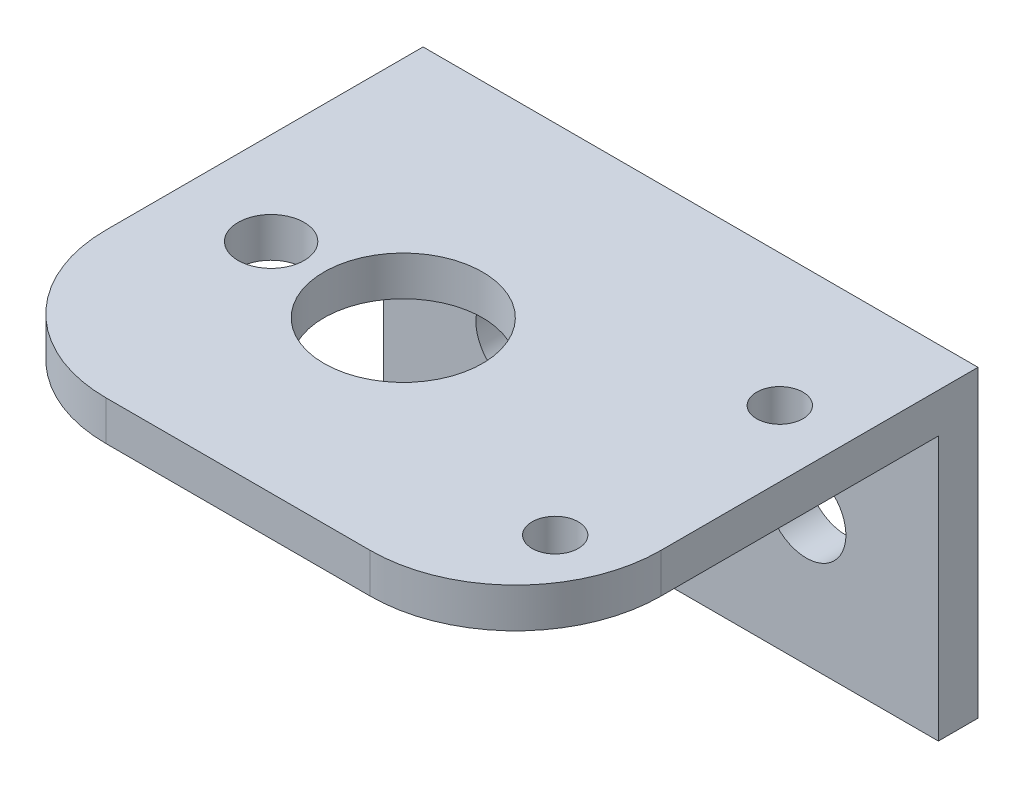
ISO-10303-21;
HEADER;
FILE_DESCRIPTION(('STEP AP214'),'2;1');
FILE_NAME('part.step','',(''),(''),'','','');
FILE_SCHEMA(('AUTOMOTIVE_DESIGN { 1 0 10303 214 1 1 1 1 }'));
ENDSEC;
DATA;
#1=APPLICATION_CONTEXT('core data for automotive mechanical design processes');
#2=APPLICATION_PROTOCOL_DEFINITION('international standard','automotive_design',2000,#1);
#3=PRODUCT_CONTEXT('',#1,'mechanical');
#4=PRODUCT('Part','Part','',(#3));
#5=PRODUCT_RELATED_PRODUCT_CATEGORY('part','',(#4));
#6=PRODUCT_DEFINITION_FORMATION('','',#4);
#7=PRODUCT_DEFINITION_CONTEXT('part definition',#1,'design');
#8=PRODUCT_DEFINITION('design','',#6,#7);
#9=PRODUCT_DEFINITION_SHAPE('','',#8);
#10=(LENGTH_UNIT() NAMED_UNIT(*) SI_UNIT(.MILLI.,.METRE.));
#11=(NAMED_UNIT(*) PLANE_ANGLE_UNIT() SI_UNIT($,.RADIAN.));
#12=(NAMED_UNIT(*) SI_UNIT($,.STERADIAN.) SOLID_ANGLE_UNIT());
#13=UNCERTAINTY_MEASURE_WITH_UNIT(LENGTH_MEASURE(1.E-05),#10,'distance_accuracy_value','');
#14=(GEOMETRIC_REPRESENTATION_CONTEXT(3) GLOBAL_UNCERTAINTY_ASSIGNED_CONTEXT((#13)) GLOBAL_UNIT_ASSIGNED_CONTEXT((#10,
#11,#12)) REPRESENTATION_CONTEXT('',''));
#15=CARTESIAN_POINT('',(0.,0.,0.));
#16=DIRECTION('',(0.,0.,1.));
#17=DIRECTION('',(1.,0.,0.));
#18=AXIS2_PLACEMENT_3D('',#15,#16,#17);
#19=CARTESIAN_POINT('',(0.,0.,0.));
#20=DIRECTION('',(0.,1.,0.));
#21=DIRECTION('',(0.,0.,1.));
#22=AXIS2_PLACEMENT_3D('',#19,#20,#21);
#23=PLANE('',#22);
#24=DIRECTION('',(-1.,0.,0.));
#25=VECTOR('',#24,1.);
#26=CARTESIAN_POINT('',(0.,0.,3.));
#27=LINE('',#26,#25);
#28=CARTESIAN_POINT('',(0.,0.,3.));
#29=VERTEX_POINT('',#28);
#30=CARTESIAN_POINT('',(-42.,0.,3.00000000000001));
#31=VERTEX_POINT('',#30);
#32=EDGE_CURVE('E120',#29,#31,#27,.T.);
#33=ORIENTED_EDGE('',*,*,#32,.F.);
#34=DIRECTION('',(0.,0.,1.));
#35=VECTOR('',#34,1.);
#36=CARTESIAN_POINT('',(0.,0.,0.));
#37=LINE('',#36,#35);
#38=CARTESIAN_POINT('',(0.,0.,24.));
#39=VERTEX_POINT('',#38);
#40=EDGE_CURVE('E105',#29,#39,#37,.T.);
#41=ORIENTED_EDGE('',*,*,#40,.T.);
#42=CARTESIAN_POINT('',(-11.,0.,24.));
#43=DIRECTION('',(0.,1.,0.));
#44=DIRECTION('',(0.,0.,1.));
#45=AXIS2_PLACEMENT_3D('',#42,#43,#44);
#46=CIRCLE('',#45,11.);
#47=CARTESIAN_POINT('',(-11.,0.,35.));
#48=VERTEX_POINT('',#47);
#49=EDGE_CURVE('E118',#39,#48,#46,.F.);
#50=ORIENTED_EDGE('',*,*,#49,.T.);
#51=DIRECTION('',(-1.,0.,0.));
#52=VECTOR('',#51,1.);
#53=CARTESIAN_POINT('',(0.,0.,35.));
#54=LINE('',#53,#52);
#55=CARTESIAN_POINT('',(-31.,0.,35.));
#56=VERTEX_POINT('',#55);
#57=EDGE_CURVE('E146',#48,#56,#54,.T.);
#58=ORIENTED_EDGE('',*,*,#57,.T.);
#59=CARTESIAN_POINT('',(-31.,0.,24.));
#60=DIRECTION('',(0.,1.,0.));
#61=DIRECTION('',(0.,0.,1.));
#62=AXIS2_PLACEMENT_3D('',#59,#60,#61);
#63=CIRCLE('',#62,11.);
#64=CARTESIAN_POINT('',(-42.,0.,24.));
#65=VERTEX_POINT('',#64);
#66=EDGE_CURVE('E60',#56,#65,#63,.F.);
#67=ORIENTED_EDGE('',*,*,#66,.T.);
#68=DIRECTION('',(0.,0.,-1.));
#69=VECTOR('',#68,1.);
#70=CARTESIAN_POINT('',(-42.,0.,0.));
#71=LINE('',#70,#69);
#72=EDGE_CURVE('E150',#65,#31,#71,.T.);
#73=ORIENTED_EDGE('',*,*,#72,.T.);
#74=EDGE_LOOP('',(#33,#41,#50,#58,#67,#73));
#75=FACE_BOUND('',#74,.T.);
#76=CARTESIAN_POINT('',(-35.,0.,18.5));
#77=DIRECTION('',(0.,-1.,0.));
#78=DIRECTION('',(0.,0.,1.));
#79=AXIS2_PLACEMENT_3D('',#76,#77,#78);
#80=CIRCLE('',#79,2.5);
#81=CARTESIAN_POINT('',(-35.,0.,21.));
#82=VERTEX_POINT('',#81);
#83=EDGE_CURVE('E217',#82,#82,#80,.T.);
#84=ORIENTED_EDGE('',*,*,#83,.F.);
#85=EDGE_LOOP('',(#84));
#86=FACE_BOUND('',#85,.T.);
#87=CARTESIAN_POINT('',(-25.,0.,18.5));
#88=DIRECTION('',(0.,-1.,0.));
#89=DIRECTION('',(0.,0.,1.));
#90=AXIS2_PLACEMENT_3D('',#87,#88,#89);
#91=CIRCLE('',#90,6.);
#92=CARTESIAN_POINT('',(-25.,0.,24.5));
#93=VERTEX_POINT('',#92);
#94=EDGE_CURVE('E225',#93,#93,#91,.T.);
#95=ORIENTED_EDGE('',*,*,#94,.F.);
#96=EDGE_LOOP('',(#95));
#97=FACE_BOUND('',#96,.T.);
#98=CARTESIAN_POINT('',(-5.,0.,27.));
#99=DIRECTION('',(0.,-1.,0.));
#100=DIRECTION('',(0.,0.,1.));
#101=AXIS2_PLACEMENT_3D('',#98,#99,#100);
#102=CIRCLE('',#101,1.74999999999998);
#103=CARTESIAN_POINT('',(-5.,0.,28.75));
#104=VERTEX_POINT('',#103);
#105=EDGE_CURVE('E231',#104,#104,#102,.T.);
#106=ORIENTED_EDGE('',*,*,#105,.F.);
#107=EDGE_LOOP('',(#106));
#108=FACE_BOUND('',#107,.T.);
#109=CARTESIAN_POINT('',(-5.,0.,10.));
#110=DIRECTION('',(0.,-1.,0.));
#111=DIRECTION('',(0.,0.,1.));
#112=AXIS2_PLACEMENT_3D('',#109,#110,#111);
#113=CIRCLE('',#112,1.75000000000001);
#114=CARTESIAN_POINT('',(-5.,0.,11.75));
#115=VERTEX_POINT('',#114);
#116=EDGE_CURVE('E237',#115,#115,#113,.T.);
#117=ORIENTED_EDGE('',*,*,#116,.F.);
#118=EDGE_LOOP('',(#117));
#119=FACE_BOUND('',#118,.T.);
#120=ADVANCED_FACE('F37',(#75,#86,#97,#108,#119),#23,.F.);
#121=CARTESIAN_POINT('',(0.,3.,0.));
#122=DIRECTION('',(0.,1.,0.));
#123=DIRECTION('',(0.,0.,1.));
#124=AXIS2_PLACEMENT_3D('',#121,#122,#123);
#125=PLANE('',#124);
#126=DIRECTION('',(0.,0.,1.));
#127=VECTOR('',#126,1.);
#128=CARTESIAN_POINT('',(0.,3.,0.));
#129=LINE('',#128,#127);
#130=CARTESIAN_POINT('',(0.,3.,0.));
#131=VERTEX_POINT('',#130);
#132=CARTESIAN_POINT('',(0.,3.,24.));
#133=VERTEX_POINT('',#132);
#134=EDGE_CURVE('E108',#131,#133,#129,.T.);
#135=ORIENTED_EDGE('',*,*,#134,.F.);
#136=DIRECTION('',(-1.,0.,0.));
#137=VECTOR('',#136,1.);
#138=CARTESIAN_POINT('',(0.,3.,0.));
#139=LINE('',#138,#137);
#140=CARTESIAN_POINT('',(-42.,3.,0.));
#141=VERTEX_POINT('',#140);
#142=EDGE_CURVE('E114',#131,#141,#139,.T.);
#143=ORIENTED_EDGE('',*,*,#142,.T.);
#144=DIRECTION('',(0.,0.,-1.));
#145=VECTOR('',#144,1.);
#146=CARTESIAN_POINT('',(-42.,3.,0.));
#147=LINE('',#146,#145);
#148=CARTESIAN_POINT('',(-42.,3.,24.));
#149=VERTEX_POINT('',#148);
#150=EDGE_CURVE('E142',#149,#141,#147,.T.);
#151=ORIENTED_EDGE('',*,*,#150,.F.);
#152=CARTESIAN_POINT('',(-31.,3.,24.));
#153=DIRECTION('',(0.,1.,0.));
#154=DIRECTION('',(0.,0.,1.));
#155=AXIS2_PLACEMENT_3D('',#152,#153,#154);
#156=CIRCLE('',#155,11.);
#157=CARTESIAN_POINT('',(-31.,3.,35.));
#158=VERTEX_POINT('',#157);
#159=EDGE_CURVE('E11',#149,#158,#156,.T.);
#160=ORIENTED_EDGE('',*,*,#159,.T.);
#161=DIRECTION('',(-1.,0.,0.));
#162=VECTOR('',#161,1.);
#163=CARTESIAN_POINT('',(0.,3.,35.));
#164=LINE('',#163,#162);
#165=CARTESIAN_POINT('',(-11.,3.,35.));
#166=VERTEX_POINT('',#165);
#167=EDGE_CURVE('E137',#166,#158,#164,.T.);
#168=ORIENTED_EDGE('',*,*,#167,.F.);
#169=CARTESIAN_POINT('',(-11.,3.,24.));
#170=DIRECTION('',(0.,1.,0.));
#171=DIRECTION('',(0.,0.,1.));
#172=AXIS2_PLACEMENT_3D('',#169,#170,#171);
#173=CIRCLE('',#172,11.);
#174=EDGE_CURVE('E45',#166,#133,#173,.T.);
#175=ORIENTED_EDGE('',*,*,#174,.T.);
#176=EDGE_LOOP('',(#135,#143,#151,#160,#168,#175));
#177=FACE_BOUND('',#176,.T.);
#178=CARTESIAN_POINT('',(-35.,3.,18.5));
#179=DIRECTION('',(0.,-1.,0.));
#180=DIRECTION('',(0.,0.,1.));
#181=AXIS2_PLACEMENT_3D('',#178,#179,#180);
#182=CIRCLE('',#181,2.5);
#183=CARTESIAN_POINT('',(-35.,3.,21.));
#184=VERTEX_POINT('',#183);
#185=EDGE_CURVE('E222',#184,#184,#182,.T.);
#186=ORIENTED_EDGE('',*,*,#185,.T.);
#187=EDGE_LOOP('',(#186));
#188=FACE_BOUND('',#187,.T.);
#189=CARTESIAN_POINT('',(-25.,3.,18.5));
#190=DIRECTION('',(0.,-1.,0.));
#191=DIRECTION('',(0.,0.,1.));
#192=AXIS2_PLACEMENT_3D('',#189,#190,#191);
#193=CIRCLE('',#192,6.);
#194=CARTESIAN_POINT('',(-25.,3.,24.5));
#195=VERTEX_POINT('',#194);
#196=EDGE_CURVE('E228',#195,#195,#193,.T.);
#197=ORIENTED_EDGE('',*,*,#196,.T.);
#198=EDGE_LOOP('',(#197));
#199=FACE_BOUND('',#198,.T.);
#200=CARTESIAN_POINT('',(-5.,3.,27.));
#201=DIRECTION('',(0.,-1.,0.));
#202=DIRECTION('',(0.,0.,1.));
#203=AXIS2_PLACEMENT_3D('',#200,#201,#202);
#204=CIRCLE('',#203,1.74999999999998);
#205=CARTESIAN_POINT('',(-5.,3.,28.75));
#206=VERTEX_POINT('',#205);
#207=EDGE_CURVE('E234',#206,#206,#204,.T.);
#208=ORIENTED_EDGE('',*,*,#207,.T.);
#209=EDGE_LOOP('',(#208));
#210=FACE_BOUND('',#209,.T.);
#211=CARTESIAN_POINT('',(-5.,3.,10.));
#212=DIRECTION('',(0.,-1.,0.));
#213=DIRECTION('',(0.,0.,1.));
#214=AXIS2_PLACEMENT_3D('',#211,#212,#213);
#215=CIRCLE('',#214,1.75000000000001);
#216=CARTESIAN_POINT('',(-5.,3.,11.75));
#217=VERTEX_POINT('',#216);
#218=EDGE_CURVE('E152',#217,#217,#215,.T.);
#219=ORIENTED_EDGE('',*,*,#218,.T.);
#220=EDGE_LOOP('',(#219));
#221=FACE_BOUND('',#220,.T.);
#222=ADVANCED_FACE('F133',(#177,#188,#199,#210,#221),#125,.T.);
#223=CARTESIAN_POINT('',(0.,3.,0.));
#224=DIRECTION('',(0.,0.,1.));
#225=DIRECTION('',(1.,0.,0.));
#226=AXIS2_PLACEMENT_3D('',#223,#224,#225);
#227=PLANE('',#226);
#228=CARTESIAN_POINT('',(-32.,-10.,0.));
#229=DIRECTION('',(0.,0.,1.));
#230=DIRECTION('',(1.,0.,0.));
#231=AXIS2_PLACEMENT_3D('',#228,#229,#230);
#232=CIRCLE('',#231,3.);
#233=CARTESIAN_POINT('',(-29.,-10.,0.));
#234=VERTEX_POINT('',#233);
#235=EDGE_CURVE('E165',#234,#234,#232,.T.);
#236=ORIENTED_EDGE('',*,*,#235,.T.);
#237=EDGE_LOOP('',(#236));
#238=FACE_BOUND('',#237,.T.);
#239=CARTESIAN_POINT('',(-10.,-9.99999999999999,0.));
#240=DIRECTION('',(0.,0.,1.));
#241=DIRECTION('',(1.,0.,0.));
#242=AXIS2_PLACEMENT_3D('',#239,#240,#241);
#243=CIRCLE('',#242,3.);
#244=CARTESIAN_POINT('',(-7.,-9.99999999999999,0.));
#245=VERTEX_POINT('',#244);
#246=EDGE_CURVE('E203',#245,#245,#243,.T.);
#247=ORIENTED_EDGE('',*,*,#246,.T.);
#248=EDGE_LOOP('',(#247));
#249=FACE_BOUND('',#248,.T.);
#250=ORIENTED_EDGE('',*,*,#142,.F.);
#251=DIRECTION('',(0.,-1.,0.));
#252=VECTOR('',#251,1.);
#253=CARTESIAN_POINT('',(0.,3.,0.));
#254=LINE('',#253,#252);
#255=CARTESIAN_POINT('',(0.,-20.,0.));
#256=VERTEX_POINT('',#255);
#257=EDGE_CURVE('E206',#131,#256,#254,.T.);
#258=ORIENTED_EDGE('',*,*,#257,.T.);
#259=DIRECTION('',(1.,0.,0.));
#260=VECTOR('',#259,1.);
#261=CARTESIAN_POINT('',(0.,-20.,0.));
#262=LINE('',#261,#260);
#263=CARTESIAN_POINT('',(-42.,-20.,0.));
#264=VERTEX_POINT('',#263);
#265=EDGE_CURVE('E154',#264,#256,#262,.T.);
#266=ORIENTED_EDGE('',*,*,#265,.F.);
#267=DIRECTION('',(0.,-1.,0.));
#268=VECTOR('',#267,1.);
#269=CARTESIAN_POINT('',(-42.,3.,0.));
#270=LINE('',#269,#268);
#271=EDGE_CURVE('E141',#141,#264,#270,.T.);
#272=ORIENTED_EDGE('',*,*,#271,.F.);
#273=EDGE_LOOP('',(#250,#258,#266,#272));
#274=FACE_BOUND('',#273,.T.);
#275=ADVANCED_FACE('F186',(#238,#249,#274),#227,.F.);
#276=CARTESIAN_POINT('',(0.,-20.,3.));
#277=DIRECTION('',(0.,0.,-1.));
#278=DIRECTION('',(-1.,0.,0.));
#279=AXIS2_PLACEMENT_3D('',#276,#277,#278);
#280=PLANE('',#279);
#281=CARTESIAN_POINT('',(-32.,-10.,3.));
#282=DIRECTION('',(0.,0.,-1.));
#283=DIRECTION('',(-1.,0.,0.));
#284=AXIS2_PLACEMENT_3D('',#281,#282,#283);
#285=CIRCLE('',#284,3.);
#286=CARTESIAN_POINT('',(-35.,-10.,3.));
#287=VERTEX_POINT('',#286);
#288=EDGE_CURVE('E164',#287,#287,#285,.F.);
#289=ORIENTED_EDGE('',*,*,#288,.F.);
#290=EDGE_LOOP('',(#289));
#291=FACE_BOUND('',#290,.T.);
#292=CARTESIAN_POINT('',(-10.,-9.99999999999999,3.));
#293=DIRECTION('',(0.,0.,-1.));
#294=DIRECTION('',(-1.,0.,0.));
#295=AXIS2_PLACEMENT_3D('',#292,#293,#294);
#296=CIRCLE('',#295,3.);
#297=CARTESIAN_POINT('',(-13.,-9.99999999999999,3.));
#298=VERTEX_POINT('',#297);
#299=EDGE_CURVE('E161',#298,#298,#296,.F.);
#300=ORIENTED_EDGE('',*,*,#299,.F.);
#301=EDGE_LOOP('',(#300));
#302=FACE_BOUND('',#301,.T.);
#303=DIRECTION('',(-1.,0.,0.));
#304=VECTOR('',#303,1.);
#305=CARTESIAN_POINT('',(0.,-20.,3.));
#306=LINE('',#305,#304);
#307=CARTESIAN_POINT('',(0.,-20.,3.));
#308=VERTEX_POINT('',#307);
#309=CARTESIAN_POINT('',(-42.,-20.,3.00000000000001));
#310=VERTEX_POINT('',#309);
#311=EDGE_CURVE('E157',#308,#310,#306,.T.);
#312=ORIENTED_EDGE('',*,*,#311,.F.);
#313=DIRECTION('',(0.,1.,0.));
#314=VECTOR('',#313,1.);
#315=CARTESIAN_POINT('',(0.,-20.,3.));
#316=LINE('',#315,#314);
#317=EDGE_CURVE('E121',#308,#29,#316,.T.);
#318=ORIENTED_EDGE('',*,*,#317,.T.);
#319=ORIENTED_EDGE('',*,*,#32,.T.);
#320=DIRECTION('',(0.,1.,0.));
#321=VECTOR('',#320,1.);
#322=CARTESIAN_POINT('',(-42.,-20.,3.00000000000001));
#323=LINE('',#322,#321);
#324=EDGE_CURVE('E215',#310,#31,#323,.T.);
#325=ORIENTED_EDGE('',*,*,#324,.F.);
#326=EDGE_LOOP('',(#312,#318,#319,#325));
#327=FACE_BOUND('',#326,.T.);
#328=ADVANCED_FACE('F190',(#291,#302,#327),#280,.F.);
#329=CARTESIAN_POINT('',(0.,-20.,0.));
#330=DIRECTION('',(0.,1.,0.));
#331=DIRECTION('',(0.,0.,1.));
#332=AXIS2_PLACEMENT_3D('',#329,#330,#331);
#333=PLANE('',#332);
#334=ORIENTED_EDGE('',*,*,#265,.T.);
#335=DIRECTION('',(0.,0.,1.));
#336=VECTOR('',#335,1.);
#337=CARTESIAN_POINT('',(0.,-20.,0.));
#338=LINE('',#337,#336);
#339=EDGE_CURVE('E392',#256,#308,#338,.T.);
#340=ORIENTED_EDGE('',*,*,#339,.T.);
#341=ORIENTED_EDGE('',*,*,#311,.T.);
#342=DIRECTION('',(0.,0.,1.));
#343=VECTOR('',#342,1.);
#344=CARTESIAN_POINT('',(-42.,-20.,0.));
#345=LINE('',#344,#343);
#346=EDGE_CURVE('E167',#264,#310,#345,.T.);
#347=ORIENTED_EDGE('',*,*,#346,.F.);
#348=EDGE_LOOP('',(#334,#340,#341,#347));
#349=FACE_BOUND('',#348,.T.);
#350=ADVANCED_FACE('F195',(#349),#333,.F.);
#351=CARTESIAN_POINT('',(-42.,3.,0.));
#352=DIRECTION('',(-1.,0.,0.));
#353=DIRECTION('',(0.,0.,1.));
#354=AXIS2_PLACEMENT_3D('',#351,#352,#353);
#355=PLANE('',#354);
#356=ORIENTED_EDGE('',*,*,#72,.F.);
#357=DIRECTION('',(0.,-1.,0.));
#358=VECTOR('',#357,1.);
#359=CARTESIAN_POINT('',(-42.,3.,24.));
#360=LINE('',#359,#358);
#361=EDGE_CURVE('E52',#65,#149,#360,.F.);
#362=ORIENTED_EDGE('',*,*,#361,.T.);
#363=ORIENTED_EDGE('',*,*,#150,.T.);
#364=ORIENTED_EDGE('',*,*,#271,.T.);
#365=ORIENTED_EDGE('',*,*,#346,.T.);
#366=ORIENTED_EDGE('',*,*,#324,.T.);
#367=EDGE_LOOP('',(#356,#362,#363,#364,#365,#366));
#368=FACE_BOUND('',#367,.T.);
#369=ADVANCED_FACE('F207',(#368),#355,.T.);
#370=CARTESIAN_POINT('',(0.,3.,35.));
#371=DIRECTION('',(0.,0.,1.));
#372=DIRECTION('',(1.,0.,0.));
#373=AXIS2_PLACEMENT_3D('',#370,#371,#372);
#374=PLANE('',#373);
#375=ORIENTED_EDGE('',*,*,#167,.T.);
#376=DIRECTION('',(0.,-1.,0.));
#377=VECTOR('',#376,1.);
#378=CARTESIAN_POINT('',(-31.,3.,35.));
#379=LINE('',#378,#377);
#380=EDGE_CURVE('E124',#158,#56,#379,.T.);
#381=ORIENTED_EDGE('',*,*,#380,.T.);
#382=ORIENTED_EDGE('',*,*,#57,.F.);
#383=DIRECTION('',(0.,-1.,0.));
#384=VECTOR('',#383,1.);
#385=CARTESIAN_POINT('',(-11.,3.,35.));
#386=LINE('',#385,#384);
#387=EDGE_CURVE('E113',#48,#166,#386,.F.);
#388=ORIENTED_EDGE('',*,*,#387,.T.);
#389=EDGE_LOOP('',(#375,#381,#382,#388));
#390=FACE_BOUND('',#389,.T.);
#391=ADVANCED_FACE('F168',(#390),#374,.T.);
#392=CARTESIAN_POINT('',(-5.,3.,10.));
#393=DIRECTION('',(0.,-1.,0.));
#394=DIRECTION('',(0.,0.,-1.));
#395=AXIS2_PLACEMENT_3D('',#392,#393,#394);
#396=CYLINDRICAL_SURFACE('',#395,1.75000000000001);
#397=ORIENTED_EDGE('',*,*,#218,.F.);
#398=EDGE_LOOP('',(#397));
#399=FACE_BOUND('',#398,.T.);
#400=ORIENTED_EDGE('',*,*,#116,.T.);
#401=EDGE_LOOP('',(#400));
#402=FACE_BOUND('',#401,.T.);
#403=ADVANCED_FACE('F244',(#399,#402),#396,.F.);
#404=CARTESIAN_POINT('',(-5.,3.,27.));
#405=DIRECTION('',(0.,-1.,0.));
#406=DIRECTION('',(0.,0.,-1.));
#407=AXIS2_PLACEMENT_3D('',#404,#405,#406);
#408=CYLINDRICAL_SURFACE('',#407,1.74999999999998);
#409=ORIENTED_EDGE('',*,*,#207,.F.);
#410=EDGE_LOOP('',(#409));
#411=FACE_BOUND('',#410,.T.);
#412=ORIENTED_EDGE('',*,*,#105,.T.);
#413=EDGE_LOOP('',(#412));
#414=FACE_BOUND('',#413,.T.);
#415=ADVANCED_FACE('F247',(#411,#414),#408,.F.);
#416=CARTESIAN_POINT('',(-25.,3.,18.5));
#417=DIRECTION('',(0.,-1.,0.));
#418=DIRECTION('',(0.,0.,-1.));
#419=AXIS2_PLACEMENT_3D('',#416,#417,#418);
#420=CYLINDRICAL_SURFACE('',#419,6.);
#421=ORIENTED_EDGE('',*,*,#196,.F.);
#422=EDGE_LOOP('',(#421));
#423=FACE_BOUND('',#422,.T.);
#424=ORIENTED_EDGE('',*,*,#94,.T.);
#425=EDGE_LOOP('',(#424));
#426=FACE_BOUND('',#425,.T.);
#427=ADVANCED_FACE('F254',(#423,#426),#420,.F.);
#428=CARTESIAN_POINT('',(-35.,3.,18.5));
#429=DIRECTION('',(0.,-1.,0.));
#430=DIRECTION('',(0.,0.,-1.));
#431=AXIS2_PLACEMENT_3D('',#428,#429,#430);
#432=CYLINDRICAL_SURFACE('',#431,2.5);
#433=ORIENTED_EDGE('',*,*,#185,.F.);
#434=EDGE_LOOP('',(#433));
#435=FACE_BOUND('',#434,.T.);
#436=ORIENTED_EDGE('',*,*,#83,.T.);
#437=EDGE_LOOP('',(#436));
#438=FACE_BOUND('',#437,.T.);
#439=ADVANCED_FACE('F297',(#435,#438),#432,.F.);
#440=CARTESIAN_POINT('',(-10.,-9.99999999999999,20.));
#441=DIRECTION('',(0.,0.,-1.));
#442=DIRECTION('',(-1.,0.,0.));
#443=AXIS2_PLACEMENT_3D('',#440,#441,#442);
#444=CYLINDRICAL_SURFACE('',#443,3.);
#445=ORIENTED_EDGE('',*,*,#246,.F.);
#446=EDGE_LOOP('',(#445));
#447=FACE_BOUND('',#446,.T.);
#448=ORIENTED_EDGE('',*,*,#299,.T.);
#449=EDGE_LOOP('',(#448));
#450=FACE_BOUND('',#449,.T.);
#451=ADVANCED_FACE('F177',(#447,#450),#444,.F.);
#452=CARTESIAN_POINT('',(-32.,-10.,20.));
#453=DIRECTION('',(0.,0.,-1.));
#454=DIRECTION('',(-1.,0.,0.));
#455=AXIS2_PLACEMENT_3D('',#452,#453,#454);
#456=CYLINDRICAL_SURFACE('',#455,3.);
#457=ORIENTED_EDGE('',*,*,#235,.F.);
#458=EDGE_LOOP('',(#457));
#459=FACE_BOUND('',#458,.T.);
#460=ORIENTED_EDGE('',*,*,#288,.T.);
#461=EDGE_LOOP('',(#460));
#462=FACE_BOUND('',#461,.T.);
#463=ADVANCED_FACE('F172',(#459,#462),#456,.F.);
#464=CARTESIAN_POINT('',(-31.,3.,24.));
#465=DIRECTION('',(0.,-1.,0.));
#466=DIRECTION('',(0.,0.,-1.));
#467=AXIS2_PLACEMENT_3D('',#464,#465,#466);
#468=CYLINDRICAL_SURFACE('',#467,11.);
#469=ORIENTED_EDGE('',*,*,#159,.F.);
#470=ORIENTED_EDGE('',*,*,#361,.F.);
#471=ORIENTED_EDGE('',*,*,#66,.F.);
#472=ORIENTED_EDGE('',*,*,#380,.F.);
#473=EDGE_LOOP('',(#469,#470,#471,#472));
#474=FACE_BOUND('',#473,.T.);
#475=ADVANCED_FACE('F170',(#474),#468,.T.);
#476=CARTESIAN_POINT('',(-11.,3.,24.));
#477=DIRECTION('',(0.,-1.,0.));
#478=DIRECTION('',(0.,0.,-1.));
#479=AXIS2_PLACEMENT_3D('',#476,#477,#478);
#480=CYLINDRICAL_SURFACE('',#479,11.);
#481=ORIENTED_EDGE('',*,*,#174,.F.);
#482=ORIENTED_EDGE('',*,*,#387,.F.);
#483=ORIENTED_EDGE('',*,*,#49,.F.);
#484=DIRECTION('',(0.,-1.,0.));
#485=VECTOR('',#484,1.);
#486=CARTESIAN_POINT('',(0.,3.,24.));
#487=LINE('',#486,#485);
#488=EDGE_CURVE('E102',#39,#133,#487,.F.);
#489=ORIENTED_EDGE('',*,*,#488,.T.);
#490=EDGE_LOOP('',(#481,#482,#483,#489));
#491=FACE_BOUND('',#490,.T.);
#492=ADVANCED_FACE('F39',(#491),#480,.T.);
#493=CARTESIAN_POINT('',(0.,0.,0.));
#494=DIRECTION('',(-1.,0.,0.));
#495=DIRECTION('',(0.,0.,1.));
#496=AXIS2_PLACEMENT_3D('',#493,#494,#495);
#497=PLANE('',#496);
#498=ORIENTED_EDGE('',*,*,#257,.F.);
#499=ORIENTED_EDGE('',*,*,#134,.T.);
#500=ORIENTED_EDGE('',*,*,#488,.F.);
#501=ORIENTED_EDGE('',*,*,#40,.F.);
#502=ORIENTED_EDGE('',*,*,#317,.F.);
#503=ORIENTED_EDGE('',*,*,#339,.F.);
#504=EDGE_LOOP('',(#498,#499,#500,#501,#502,#503));
#505=FACE_BOUND('',#504,.T.);
#506=ADVANCED_FACE('F104',(#505),#497,.F.);
#507=CLOSED_SHELL('',(#120,#222,#275,#328,#350,#369,#391,#403,#415,#427,#439,#451,#463,#475,
#492,#506));
#508=MANIFOLD_SOLID_BREP('B2',#507);
#509=ADVANCED_BREP_SHAPE_REPRESENTATION('',(#18,#508),#14);
#510=SHAPE_DEFINITION_REPRESENTATION(#9,#509);
ENDSEC;
END-ISO-10303-21;
